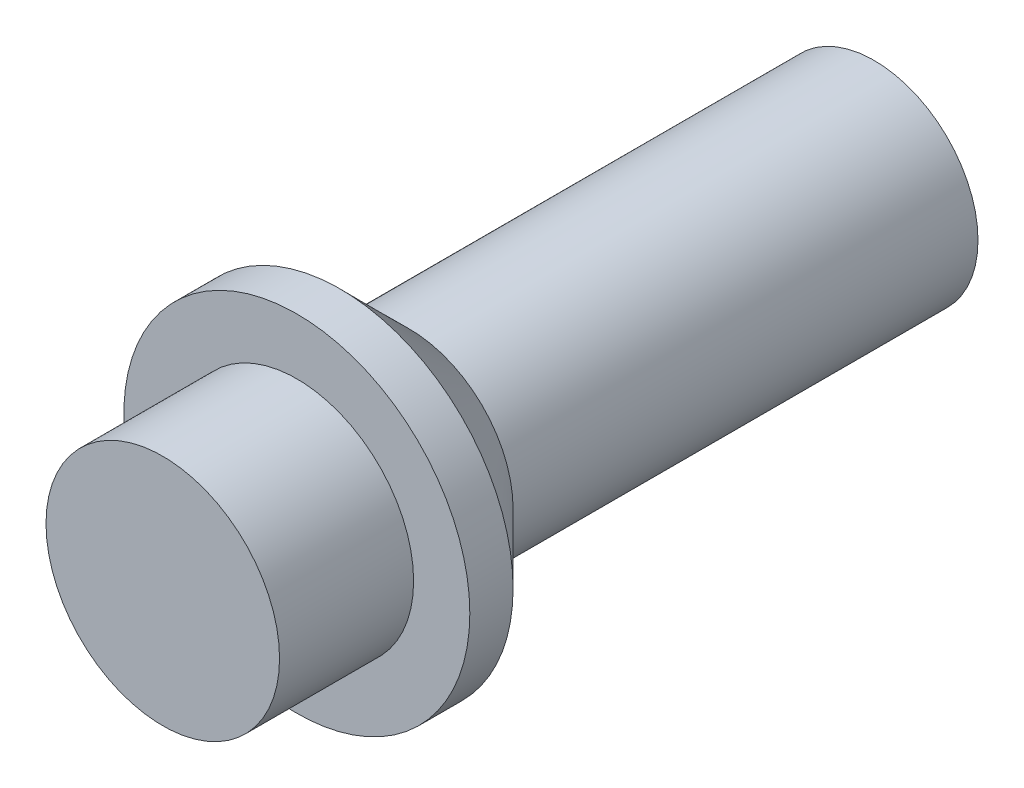
ISO-10303-21;
HEADER;
FILE_DESCRIPTION(('STEP AP214'),'2;1');
FILE_NAME('part.step','',(''),(''),'','','');
FILE_SCHEMA(('AUTOMOTIVE_DESIGN { 1 0 10303 214 1 1 1 1 }'));
ENDSEC;
DATA;
#1=APPLICATION_CONTEXT('core data for automotive mechanical design processes');
#2=APPLICATION_PROTOCOL_DEFINITION('international standard','automotive_design',2000,#1);
#3=PRODUCT_CONTEXT('',#1,'mechanical');
#4=PRODUCT('Part','Part','',(#3));
#5=PRODUCT_RELATED_PRODUCT_CATEGORY('part','',(#4));
#6=PRODUCT_DEFINITION_FORMATION('','',#4);
#7=PRODUCT_DEFINITION_CONTEXT('part definition',#1,'design');
#8=PRODUCT_DEFINITION('design','',#6,#7);
#9=PRODUCT_DEFINITION_SHAPE('','',#8);
#10=(LENGTH_UNIT() NAMED_UNIT(*) SI_UNIT(.MILLI.,.METRE.));
#11=(NAMED_UNIT(*) PLANE_ANGLE_UNIT() SI_UNIT($,.RADIAN.));
#12=(NAMED_UNIT(*) SI_UNIT($,.STERADIAN.) SOLID_ANGLE_UNIT());
#13=UNCERTAINTY_MEASURE_WITH_UNIT(LENGTH_MEASURE(1.E-05),#10,'distance_accuracy_value','');
#14=(GEOMETRIC_REPRESENTATION_CONTEXT(3) GLOBAL_UNCERTAINTY_ASSIGNED_CONTEXT((#13)) GLOBAL_UNIT_ASSIGNED_CONTEXT((#10,
#11,#12)) REPRESENTATION_CONTEXT('',''));
#15=CARTESIAN_POINT('',(0.,0.,0.));
#16=DIRECTION('',(0.,0.,1.));
#17=DIRECTION('',(1.,0.,0.));
#18=AXIS2_PLACEMENT_3D('',#15,#16,#17);
#19=CARTESIAN_POINT('',(0.,0.,35.));
#20=DIRECTION('',(0.,0.,-1.));
#21=DIRECTION('',(-1.,0.,0.));
#22=AXIS2_PLACEMENT_3D('',#19,#20,#21);
#23=CYLINDRICAL_SURFACE('',#22,2.4);
#24=CARTESIAN_POINT('',(0.,0.,35.));
#25=DIRECTION('',(0.,0.,1.));
#26=DIRECTION('',(1.,0.,0.));
#27=AXIS2_PLACEMENT_3D('',#24,#25,#26);
#28=CIRCLE('',#27,2.4);
#29=CARTESIAN_POINT('',(2.4,0.,35.));
#30=VERTEX_POINT('',#29);
#31=EDGE_CURVE('E46',#30,#30,#28,.T.);
#32=ORIENTED_EDGE('',*,*,#31,.F.);
#33=EDGE_LOOP('',(#32));
#34=FACE_BOUND('',#33,.T.);
#35=CARTESIAN_POINT('',(0.,0.,24.25));
#36=DIRECTION('',(0.,0.,1.));
#37=DIRECTION('',(1.,0.,0.));
#38=AXIS2_PLACEMENT_3D('',#35,#36,#37);
#39=CIRCLE('',#38,2.4);
#40=CARTESIAN_POINT('',(2.4,0.,24.25));
#41=VERTEX_POINT('',#40);
#42=EDGE_CURVE('E45',#41,#41,#39,.T.);
#43=ORIENTED_EDGE('',*,*,#42,.T.);
#44=EDGE_LOOP('',(#43));
#45=FACE_BOUND('',#44,.T.);
#46=ADVANCED_FACE('F39',(#34,#45),#23,.T.);
#47=CARTESIAN_POINT('',(0.,0.,24.25));
#48=DIRECTION('',(0.,0.,1.));
#49=DIRECTION('',(1.,0.,0.));
#50=AXIS2_PLACEMENT_3D('',#47,#48,#49);
#51=PLANE('',#50);
#52=ORIENTED_EDGE('',*,*,#42,.F.);
#53=EDGE_LOOP('',(#52));
#54=FACE_BOUND('',#53,.T.);
#55=ADVANCED_FACE('F65',(#54),#51,.F.);
#56=CARTESIAN_POINT('',(0.,0.,35.));
#57=DIRECTION('',(0.,0.,1.));
#58=DIRECTION('',(1.,0.,0.));
#59=AXIS2_PLACEMENT_3D('',#56,#57,#58);
#60=CONICAL_SURFACE('',#59,2.4,0.785398163397448);
#61=CARTESIAN_POINT('',(0.,0.,36.6));
#62=DIRECTION('',(0.,0.,1.));
#63=DIRECTION('',(1.,0.,0.));
#64=AXIS2_PLACEMENT_3D('',#61,#62,#63);
#65=CIRCLE('',#64,4.);
#66=CARTESIAN_POINT('',(4.,0.,36.6));
#67=VERTEX_POINT('',#66);
#68=EDGE_CURVE('E60',#67,#67,#65,.T.);
#69=ORIENTED_EDGE('',*,*,#68,.F.);
#70=EDGE_LOOP('',(#69));
#71=FACE_BOUND('',#70,.T.);
#72=ORIENTED_EDGE('',*,*,#31,.T.);
#73=EDGE_LOOP('',(#72));
#74=FACE_BOUND('',#73,.T.);
#75=ADVANCED_FACE('F69',(#71,#74),#60,.T.);
#76=CARTESIAN_POINT('',(0.,0.,37.6));
#77=DIRECTION('',(0.,0.,-1.));
#78=DIRECTION('',(-1.,0.,0.));
#79=AXIS2_PLACEMENT_3D('',#76,#77,#78);
#80=CYLINDRICAL_SURFACE('',#79,4.);
#81=CARTESIAN_POINT('',(0.,0.,37.6));
#82=DIRECTION('',(0.,0.,1.));
#83=DIRECTION('',(1.,0.,0.));
#84=AXIS2_PLACEMENT_3D('',#81,#82,#83);
#85=CIRCLE('',#84,4.);
#86=CARTESIAN_POINT('',(4.,0.,37.6));
#87=VERTEX_POINT('',#86);
#88=EDGE_CURVE('E53',#87,#87,#85,.T.);
#89=ORIENTED_EDGE('',*,*,#88,.F.);
#90=EDGE_LOOP('',(#89));
#91=FACE_BOUND('',#90,.T.);
#92=ORIENTED_EDGE('',*,*,#68,.T.);
#93=EDGE_LOOP('',(#92));
#94=FACE_BOUND('',#93,.T.);
#95=ADVANCED_FACE('F75',(#91,#94),#80,.T.);
#96=CARTESIAN_POINT('',(0.,0.,37.6));
#97=DIRECTION('',(0.,0.,1.));
#98=DIRECTION('',(1.,0.,0.));
#99=AXIS2_PLACEMENT_3D('',#96,#97,#98);
#100=PLANE('',#99);
#101=CARTESIAN_POINT('',(0.,0.,37.6));
#102=DIRECTION('',(0.,0.,1.));
#103=DIRECTION('',(1.,0.,0.));
#104=AXIS2_PLACEMENT_3D('',#101,#102,#103);
#105=CIRCLE('',#104,2.7);
#106=CARTESIAN_POINT('',(2.7,0.,37.6));
#107=VERTEX_POINT('',#106);
#108=EDGE_CURVE('E10',#107,#107,#105,.T.);
#109=ORIENTED_EDGE('',*,*,#108,.F.);
#110=EDGE_LOOP('',(#109));
#111=FACE_BOUND('',#110,.T.);
#112=ORIENTED_EDGE('',*,*,#88,.T.);
#113=EDGE_LOOP('',(#112));
#114=FACE_BOUND('',#113,.T.);
#115=ADVANCED_FACE('F78',(#111,#114),#100,.T.);
#116=CARTESIAN_POINT('',(0.,0.,40.7));
#117=DIRECTION('',(0.,0.,-1.));
#118=DIRECTION('',(-1.,0.,0.));
#119=AXIS2_PLACEMENT_3D('',#116,#117,#118);
#120=CYLINDRICAL_SURFACE('',#119,2.7);
#121=CARTESIAN_POINT('',(0.,0.,40.7));
#122=DIRECTION('',(0.,0.,1.));
#123=DIRECTION('',(1.,0.,0.));
#124=AXIS2_PLACEMENT_3D('',#121,#122,#123);
#125=CIRCLE('',#124,2.7);
#126=CARTESIAN_POINT('',(2.7,0.,40.7));
#127=VERTEX_POINT('',#126);
#128=EDGE_CURVE('E52',#127,#127,#125,.T.);
#129=ORIENTED_EDGE('',*,*,#128,.F.);
#130=EDGE_LOOP('',(#129));
#131=FACE_BOUND('',#130,.T.);
#132=ORIENTED_EDGE('',*,*,#108,.T.);
#133=EDGE_LOOP('',(#132));
#134=FACE_BOUND('',#133,.T.);
#135=ADVANCED_FACE('F85',(#131,#134),#120,.T.);
#136=CARTESIAN_POINT('',(0.,0.,40.7));
#137=DIRECTION('',(0.,0.,1.));
#138=DIRECTION('',(1.,0.,0.));
#139=AXIS2_PLACEMENT_3D('',#136,#137,#138);
#140=PLANE('',#139);
#141=ORIENTED_EDGE('',*,*,#128,.T.);
#142=EDGE_LOOP('',(#141));
#143=FACE_BOUND('',#142,.T.);
#144=ADVANCED_FACE('F87',(#143),#140,.T.);
#145=CLOSED_SHELL('',(#46,#55,#75,#95,#115,#135,#144));
#146=MANIFOLD_SOLID_BREP('B2',#145);
#147=ADVANCED_BREP_SHAPE_REPRESENTATION('',(#18,#146),#14);
#148=SHAPE_DEFINITION_REPRESENTATION(#9,#147);
ENDSEC;
END-ISO-10303-21;
